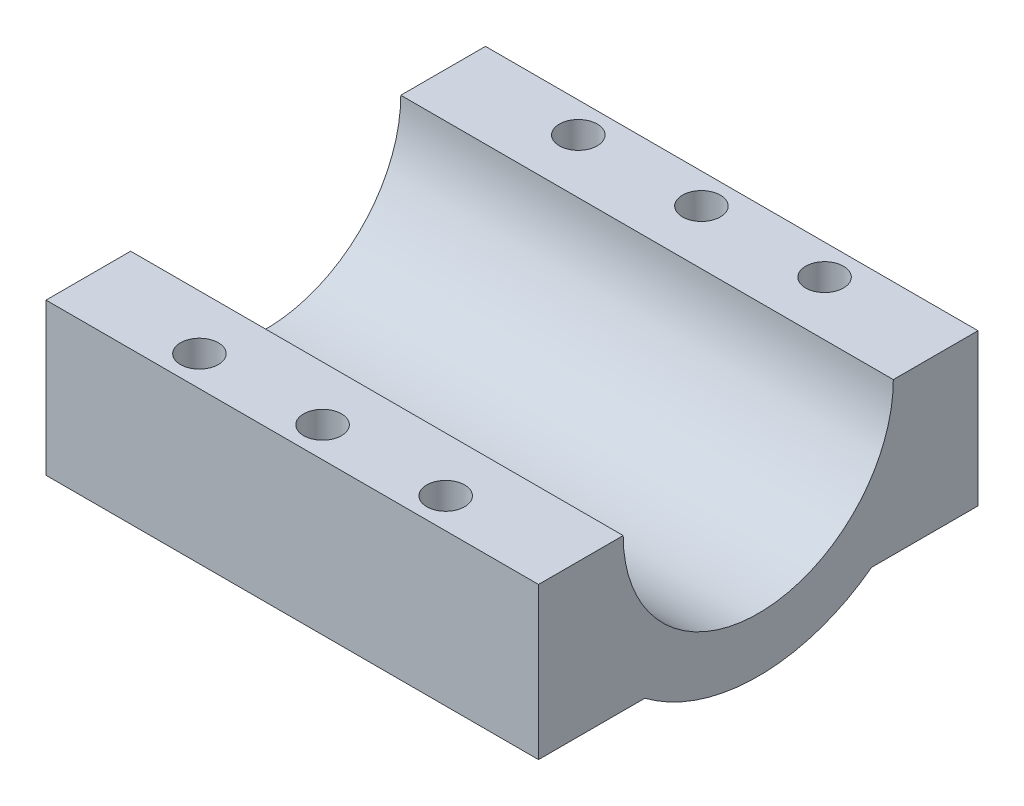
ISO-10303-21;
HEADER;
FILE_DESCRIPTION(('STEP AP214'),'2;1');
FILE_NAME('part.step','',(''),(''),'','','');
FILE_SCHEMA(('AUTOMOTIVE_DESIGN { 1 0 10303 214 1 1 1 1 }'));
ENDSEC;
DATA;
#1=APPLICATION_CONTEXT('core data for automotive mechanical design processes');
#2=APPLICATION_PROTOCOL_DEFINITION('international standard','automotive_design',2000,#1);
#3=PRODUCT_CONTEXT('',#1,'mechanical');
#4=PRODUCT('Part','Part','',(#3));
#5=PRODUCT_RELATED_PRODUCT_CATEGORY('part','',(#4));
#6=PRODUCT_DEFINITION_FORMATION('','',#4);
#7=PRODUCT_DEFINITION_CONTEXT('part definition',#1,'design');
#8=PRODUCT_DEFINITION('design','',#6,#7);
#9=PRODUCT_DEFINITION_SHAPE('','',#8);
#10=(LENGTH_UNIT() NAMED_UNIT(*) SI_UNIT(.MILLI.,.METRE.));
#11=(NAMED_UNIT(*) PLANE_ANGLE_UNIT() SI_UNIT($,.RADIAN.));
#12=(NAMED_UNIT(*) SI_UNIT($,.STERADIAN.) SOLID_ANGLE_UNIT());
#13=UNCERTAINTY_MEASURE_WITH_UNIT(LENGTH_MEASURE(1.E-05),#10,'distance_accuracy_value','');
#14=(GEOMETRIC_REPRESENTATION_CONTEXT(3) GLOBAL_UNCERTAINTY_ASSIGNED_CONTEXT((#13)) GLOBAL_UNIT_ASSIGNED_CONTEXT((#10,
#11,#12)) REPRESENTATION_CONTEXT('',''));
#15=CARTESIAN_POINT('',(0.,0.,0.));
#16=DIRECTION('',(0.,0.,1.));
#17=DIRECTION('',(1.,0.,0.));
#18=AXIS2_PLACEMENT_3D('',#15,#16,#17);
#19=CARTESIAN_POINT('',(0.,25.,0.));
#20=DIRECTION('',(0.,-1.,0.));
#21=DIRECTION('',(0.,0.,-1.));
#22=AXIS2_PLACEMENT_3D('',#19,#20,#21);
#23=PLANE('',#22);
#24=CARTESIAN_POINT('',(0.,25.,-25.));
#25=DIRECTION('',(0.,1.,0.));
#26=DIRECTION('',(0.,0.,1.));
#27=AXIS2_PLACEMENT_3D('',#24,#25,#26);
#28=CIRCLE('',#27,2.5);
#29=CARTESIAN_POINT('',(0.,25.,-22.5));
#30=VERTEX_POINT('',#29);
#31=EDGE_CURVE('E177',#30,#30,#28,.T.);
#32=ORIENTED_EDGE('',*,*,#31,.F.);
#33=EDGE_LOOP('',(#32));
#34=FACE_BOUND('',#33,.T.);
#35=CARTESIAN_POINT('',(16.25,25.,-25.));
#36=DIRECTION('',(0.,1.,0.));
#37=DIRECTION('',(0.,0.,1.));
#38=AXIS2_PLACEMENT_3D('',#35,#36,#37);
#39=CIRCLE('',#38,2.5);
#40=CARTESIAN_POINT('',(16.25,25.,-22.5));
#41=VERTEX_POINT('',#40);
#42=EDGE_CURVE('E189',#41,#41,#39,.T.);
#43=ORIENTED_EDGE('',*,*,#42,.F.);
#44=EDGE_LOOP('',(#43));
#45=FACE_BOUND('',#44,.T.);
#46=CARTESIAN_POINT('',(-16.25,25.,-25.));
#47=DIRECTION('',(0.,1.,0.));
#48=DIRECTION('',(0.,0.,1.));
#49=AXIS2_PLACEMENT_3D('',#46,#47,#48);
#50=CIRCLE('',#49,2.5);
#51=CARTESIAN_POINT('',(-16.25,25.,-22.5));
#52=VERTEX_POINT('',#51);
#53=EDGE_CURVE('E193',#52,#52,#50,.T.);
#54=ORIENTED_EDGE('',*,*,#53,.F.);
#55=EDGE_LOOP('',(#54));
#56=FACE_BOUND('',#55,.T.);
#57=DIRECTION('',(0.,0.,1.));
#58=VECTOR('',#57,1.);
#59=CARTESIAN_POINT('',(-32.5,25.,29.));
#60=LINE('',#59,#58);
#61=CARTESIAN_POINT('',(-32.5,25.,-29.));
#62=VERTEX_POINT('',#61);
#63=CARTESIAN_POINT('',(-32.5,25.,-17.825));
#64=VERTEX_POINT('',#63);
#65=EDGE_CURVE('E206',#62,#64,#60,.T.);
#66=ORIENTED_EDGE('',*,*,#65,.T.);
#67=DIRECTION('',(1.,0.,0.));
#68=VECTOR('',#67,1.);
#69=CARTESIAN_POINT('',(-32.5,25.,-17.825));
#70=LINE('',#69,#68);
#71=CARTESIAN_POINT('',(32.5,25.,-17.825));
#72=VERTEX_POINT('',#71);
#73=EDGE_CURVE('E59',#64,#72,#70,.T.);
#74=ORIENTED_EDGE('',*,*,#73,.T.);
#75=DIRECTION('',(0.,0.,-1.));
#76=VECTOR('',#75,1.);
#77=CARTESIAN_POINT('',(32.5,25.,29.));
#78=LINE('',#77,#76);
#79=CARTESIAN_POINT('',(32.5,25.,-29.));
#80=VERTEX_POINT('',#79);
#81=EDGE_CURVE('E197',#72,#80,#78,.T.);
#82=ORIENTED_EDGE('',*,*,#81,.T.);
#83=DIRECTION('',(-1.,0.,0.));
#84=VECTOR('',#83,1.);
#85=CARTESIAN_POINT('',(-32.5,25.,-29.));
#86=LINE('',#85,#84);
#87=EDGE_CURVE('E202',#80,#62,#86,.T.);
#88=ORIENTED_EDGE('',*,*,#87,.T.);
#89=EDGE_LOOP('',(#66,#74,#82,#88));
#90=FACE_BOUND('',#89,.T.);
#91=ADVANCED_FACE('F43',(#34,#45,#56,#90),#23,.F.);
#92=CARTESIAN_POINT('',(32.5,25.,29.));
#93=VERTEX_POINT('',#92);
#94=CARTESIAN_POINT('',(32.5,25.,17.825));
#95=VERTEX_POINT('',#94);
#96=EDGE_CURVE('E198',#93,#95,#78,.T.);
#97=ORIENTED_EDGE('',*,*,#96,.T.);
#98=DIRECTION('',(1.,0.,0.));
#99=VECTOR('',#98,1.);
#100=CARTESIAN_POINT('',(-32.5,25.,17.825));
#101=LINE('',#100,#99);
#102=CARTESIAN_POINT('',(-32.5,25.,17.825));
#103=VERTEX_POINT('',#102);
#104=EDGE_CURVE('E167',#95,#103,#101,.F.);
#105=ORIENTED_EDGE('',*,*,#104,.T.);
#106=CARTESIAN_POINT('',(-32.5,25.,29.));
#107=VERTEX_POINT('',#106);
#108=EDGE_CURVE('E205',#103,#107,#60,.T.);
#109=ORIENTED_EDGE('',*,*,#108,.T.);
#110=DIRECTION('',(1.,0.,0.));
#111=VECTOR('',#110,1.);
#112=CARTESIAN_POINT('',(-32.5,25.,29.));
#113=LINE('',#112,#111);
#114=EDGE_CURVE('E210',#107,#93,#113,.T.);
#115=ORIENTED_EDGE('',*,*,#114,.T.);
#116=EDGE_LOOP('',(#97,#105,#109,#115));
#117=FACE_BOUND('',#116,.T.);
#118=CARTESIAN_POINT('',(16.25,25.,25.));
#119=DIRECTION('',(0.,1.,0.));
#120=DIRECTION('',(0.,0.,-1.));
#121=AXIS2_PLACEMENT_3D('',#118,#119,#120);
#122=CIRCLE('',#121,2.5);
#123=CARTESIAN_POINT('',(16.25,25.,22.5));
#124=VERTEX_POINT('',#123);
#125=EDGE_CURVE('E185',#124,#124,#122,.T.);
#126=ORIENTED_EDGE('',*,*,#125,.F.);
#127=EDGE_LOOP('',(#126));
#128=FACE_BOUND('',#127,.T.);
#129=CARTESIAN_POINT('',(-16.25,25.,25.));
#130=DIRECTION('',(0.,1.,0.));
#131=DIRECTION('',(0.,0.,-1.));
#132=AXIS2_PLACEMENT_3D('',#129,#130,#131);
#133=CIRCLE('',#132,2.5);
#134=CARTESIAN_POINT('',(-16.25,25.,22.5));
#135=VERTEX_POINT('',#134);
#136=EDGE_CURVE('E181',#135,#135,#133,.T.);
#137=ORIENTED_EDGE('',*,*,#136,.F.);
#138=EDGE_LOOP('',(#137));
#139=FACE_BOUND('',#138,.T.);
#140=CARTESIAN_POINT('',(0.,25.,25.));
#141=DIRECTION('',(0.,1.,0.));
#142=DIRECTION('',(0.,0.,1.));
#143=AXIS2_PLACEMENT_3D('',#140,#141,#142);
#144=CIRCLE('',#143,2.5);
#145=CARTESIAN_POINT('',(0.,25.,27.5));
#146=VERTEX_POINT('',#145);
#147=EDGE_CURVE('E173',#146,#146,#144,.T.);
#148=ORIENTED_EDGE('',*,*,#147,.F.);
#149=EDGE_LOOP('',(#148));
#150=FACE_BOUND('',#149,.T.);
#151=ADVANCED_FACE('F243',(#117,#128,#139,#150),#23,.F.);
#152=CARTESIAN_POINT('',(32.5,25.,29.));
#153=DIRECTION('',(-1.,0.,0.));
#154=DIRECTION('',(0.,0.,1.));
#155=AXIS2_PLACEMENT_3D('',#152,#153,#154);
#156=PLANE('',#155);
#157=ORIENTED_EDGE('',*,*,#81,.F.);
#158=CARTESIAN_POINT('',(32.5,25.,0.));
#159=DIRECTION('',(1.,0.,0.));
#160=DIRECTION('',(0.,0.,-1.));
#161=AXIS2_PLACEMENT_3D('',#158,#159,#160);
#162=CIRCLE('',#161,17.825);
#163=EDGE_CURVE('E132',#95,#72,#162,.T.);
#164=ORIENTED_EDGE('',*,*,#163,.F.);
#165=ORIENTED_EDGE('',*,*,#96,.F.);
#166=DIRECTION('',(0.,-1.,0.));
#167=VECTOR('',#166,1.);
#168=CARTESIAN_POINT('',(32.5,25.,29.));
#169=LINE('',#168,#167);
#170=CARTESIAN_POINT('',(32.5,4.97292357485923,29.));
#171=VERTEX_POINT('',#170);
#172=EDGE_CURVE('E213',#93,#171,#169,.T.);
#173=ORIENTED_EDGE('',*,*,#172,.T.);
#174=DIRECTION('',(0.,0.,1.));
#175=VECTOR('',#174,1.);
#176=CARTESIAN_POINT('',(32.5,4.97292357485922,14.9638300532173));
#177=LINE('',#176,#175);
#178=CARTESIAN_POINT('',(32.5,4.97292357485922,14.9638300532173));
#179=VERTEX_POINT('',#178);
#180=EDGE_CURVE('E66',#179,#171,#177,.T.);
#181=ORIENTED_EDGE('',*,*,#180,.F.);
#182=CARTESIAN_POINT('',(32.5,25.,0.));
#183=DIRECTION('',(-1.,0.,0.));
#184=DIRECTION('',(0.,0.,-1.));
#185=AXIS2_PLACEMENT_3D('',#182,#183,#184);
#186=CIRCLE('',#185,25.);
#187=CARTESIAN_POINT('',(32.5,4.97292357485923,-14.9638300532173));
#188=VERTEX_POINT('',#187);
#189=EDGE_CURVE('E112',#188,#179,#186,.T.);
#190=ORIENTED_EDGE('',*,*,#189,.F.);
#191=DIRECTION('',(0.,0.,1.));
#192=VECTOR('',#191,1.);
#193=CARTESIAN_POINT('',(32.5,4.97292357485923,-29.));
#194=LINE('',#193,#192);
#195=CARTESIAN_POINT('',(32.5,4.97292357485923,-29.));
#196=VERTEX_POINT('',#195);
#197=EDGE_CURVE('E121',#196,#188,#194,.T.);
#198=ORIENTED_EDGE('',*,*,#197,.F.);
#199=DIRECTION('',(0.,-1.,0.));
#200=VECTOR('',#199,1.);
#201=CARTESIAN_POINT('',(32.5,25.,-29.));
#202=LINE('',#201,#200);
#203=EDGE_CURVE('E52',#80,#196,#202,.T.);
#204=ORIENTED_EDGE('',*,*,#203,.F.);
#205=EDGE_LOOP('',(#157,#164,#165,#173,#181,#190,#198,#204));
#206=FACE_BOUND('',#205,.T.);
#207=ADVANCED_FACE('F45',(#206),#156,.F.);
#208=CARTESIAN_POINT('',(-32.5,25.,-29.));
#209=DIRECTION('',(0.,0.,1.));
#210=DIRECTION('',(1.,0.,0.));
#211=AXIS2_PLACEMENT_3D('',#208,#209,#210);
#212=PLANE('',#211);
#213=ORIENTED_EDGE('',*,*,#203,.T.);
#214=DIRECTION('',(1.,0.,0.));
#215=VECTOR('',#214,1.);
#216=CARTESIAN_POINT('',(-32.5,4.97292357485923,-29.));
#217=LINE('',#216,#215);
#218=CARTESIAN_POINT('',(-32.5,4.97292357485923,-29.));
#219=VERTEX_POINT('',#218);
#220=EDGE_CURVE('E118',#219,#196,#217,.T.);
#221=ORIENTED_EDGE('',*,*,#220,.F.);
#222=DIRECTION('',(0.,-1.,0.));
#223=VECTOR('',#222,1.);
#224=CARTESIAN_POINT('',(-32.5,25.,-29.));
#225=LINE('',#224,#223);
#226=EDGE_CURVE('E220',#62,#219,#225,.T.);
#227=ORIENTED_EDGE('',*,*,#226,.F.);
#228=ORIENTED_EDGE('',*,*,#87,.F.);
#229=EDGE_LOOP('',(#213,#221,#227,#228));
#230=FACE_BOUND('',#229,.T.);
#231=ADVANCED_FACE('F266',(#230),#212,.F.);
#232=CARTESIAN_POINT('',(-32.5,25.,29.));
#233=DIRECTION('',(1.,0.,0.));
#234=DIRECTION('',(0.,0.,-1.));
#235=AXIS2_PLACEMENT_3D('',#232,#233,#234);
#236=PLANE('',#235);
#237=ORIENTED_EDGE('',*,*,#108,.F.);
#238=CARTESIAN_POINT('',(-32.5,25.,0.));
#239=DIRECTION('',(1.,0.,0.));
#240=DIRECTION('',(0.,0.,-1.));
#241=AXIS2_PLACEMENT_3D('',#238,#239,#240);
#242=CIRCLE('',#241,17.825);
#243=EDGE_CURVE('E11',#103,#64,#242,.T.);
#244=ORIENTED_EDGE('',*,*,#243,.T.);
#245=ORIENTED_EDGE('',*,*,#65,.F.);
#246=ORIENTED_EDGE('',*,*,#226,.T.);
#247=DIRECTION('',(0.,0.,1.));
#248=VECTOR('',#247,1.);
#249=CARTESIAN_POINT('',(-32.5,4.97292357485923,-29.));
#250=LINE('',#249,#248);
#251=CARTESIAN_POINT('',(-32.5,4.97292357485923,-14.9638300532173));
#252=VERTEX_POINT('',#251);
#253=EDGE_CURVE('E140',#219,#252,#250,.T.);
#254=ORIENTED_EDGE('',*,*,#253,.T.);
#255=CARTESIAN_POINT('',(-32.5,25.,0.));
#256=DIRECTION('',(-1.,0.,0.));
#257=DIRECTION('',(0.,0.,-1.));
#258=AXIS2_PLACEMENT_3D('',#255,#256,#257);
#259=CIRCLE('',#258,25.);
#260=CARTESIAN_POINT('',(-32.5,4.97292357485922,14.9638300532173));
#261=VERTEX_POINT('',#260);
#262=EDGE_CURVE('E114',#252,#261,#259,.T.);
#263=ORIENTED_EDGE('',*,*,#262,.T.);
#264=DIRECTION('',(0.,0.,1.));
#265=VECTOR('',#264,1.);
#266=CARTESIAN_POINT('',(-32.5,4.97292357485922,14.9638300532173));
#267=LINE('',#266,#265);
#268=CARTESIAN_POINT('',(-32.5,4.97292357485922,29.));
#269=VERTEX_POINT('',#268);
#270=EDGE_CURVE('E143',#261,#269,#267,.T.);
#271=ORIENTED_EDGE('',*,*,#270,.T.);
#272=DIRECTION('',(0.,-1.,0.));
#273=VECTOR('',#272,1.);
#274=CARTESIAN_POINT('',(-32.5,25.,29.));
#275=LINE('',#274,#273);
#276=EDGE_CURVE('E216',#107,#269,#275,.T.);
#277=ORIENTED_EDGE('',*,*,#276,.F.);
#278=EDGE_LOOP('',(#237,#244,#245,#246,#254,#263,#271,#277));
#279=FACE_BOUND('',#278,.T.);
#280=ADVANCED_FACE('F254',(#279),#236,.F.);
#281=CARTESIAN_POINT('',(-32.5,25.,29.));
#282=DIRECTION('',(0.,0.,-1.));
#283=DIRECTION('',(-1.,0.,0.));
#284=AXIS2_PLACEMENT_3D('',#281,#282,#283);
#285=PLANE('',#284);
#286=ORIENTED_EDGE('',*,*,#276,.T.);
#287=DIRECTION('',(1.,0.,0.));
#288=VECTOR('',#287,1.);
#289=CARTESIAN_POINT('',(-32.5,4.97292357485922,29.));
#290=LINE('',#289,#288);
#291=EDGE_CURVE('E268',#269,#171,#290,.T.);
#292=ORIENTED_EDGE('',*,*,#291,.T.);
#293=ORIENTED_EDGE('',*,*,#172,.F.);
#294=ORIENTED_EDGE('',*,*,#114,.F.);
#295=EDGE_LOOP('',(#286,#292,#293,#294));
#296=FACE_BOUND('',#295,.T.);
#297=ADVANCED_FACE('F277',(#296),#285,.F.);
#298=CARTESIAN_POINT('',(-16.25,25.,-25.));
#299=DIRECTION('',(0.,-1.,0.));
#300=DIRECTION('',(0.,0.,-1.));
#301=AXIS2_PLACEMENT_3D('',#298,#299,#300);
#302=CYLINDRICAL_SURFACE('',#301,2.5);
#303=CARTESIAN_POINT('',(-16.25,4.97292357485923,-25.));
#304=DIRECTION('',(0.,1.,0.));
#305=DIRECTION('',(0.,0.,1.));
#306=AXIS2_PLACEMENT_3D('',#303,#304,#305);
#307=CIRCLE('',#306,2.5);
#308=CARTESIAN_POINT('',(-16.25,4.97292357485923,-22.5));
#309=VERTEX_POINT('',#308);
#310=EDGE_CURVE('E163',#309,#309,#307,.T.);
#311=ORIENTED_EDGE('',*,*,#310,.F.);
#312=EDGE_LOOP('',(#311));
#313=FACE_BOUND('',#312,.T.);
#314=ORIENTED_EDGE('',*,*,#53,.T.);
#315=EDGE_LOOP('',(#314));
#316=FACE_BOUND('',#315,.T.);
#317=ADVANCED_FACE('F279',(#313,#316),#302,.F.);
#318=CARTESIAN_POINT('',(16.25,25.,-25.));
#319=DIRECTION('',(0.,-1.,0.));
#320=DIRECTION('',(0.,0.,-1.));
#321=AXIS2_PLACEMENT_3D('',#318,#319,#320);
#322=CYLINDRICAL_SURFACE('',#321,2.5);
#323=CARTESIAN_POINT('',(16.25,4.97292357485923,-25.));
#324=DIRECTION('',(0.,1.,0.));
#325=DIRECTION('',(0.,0.,1.));
#326=AXIS2_PLACEMENT_3D('',#323,#324,#325);
#327=CIRCLE('',#326,2.5);
#328=CARTESIAN_POINT('',(16.25,4.97292357485923,-22.5));
#329=VERTEX_POINT('',#328);
#330=EDGE_CURVE('E159',#329,#329,#327,.T.);
#331=ORIENTED_EDGE('',*,*,#330,.F.);
#332=EDGE_LOOP('',(#331));
#333=FACE_BOUND('',#332,.T.);
#334=ORIENTED_EDGE('',*,*,#42,.T.);
#335=EDGE_LOOP('',(#334));
#336=FACE_BOUND('',#335,.T.);
#337=ADVANCED_FACE('F285',(#333,#336),#322,.F.);
#338=CARTESIAN_POINT('',(16.25,25.,25.));
#339=DIRECTION('',(0.,-1.,0.));
#340=DIRECTION('',(0.,0.,-1.));
#341=AXIS2_PLACEMENT_3D('',#338,#339,#340);
#342=CYLINDRICAL_SURFACE('',#341,2.5);
#343=CARTESIAN_POINT('',(16.25,4.97292357485922,25.));
#344=DIRECTION('',(0.,1.,0.));
#345=DIRECTION('',(0.,0.,1.));
#346=AXIS2_PLACEMENT_3D('',#343,#344,#345);
#347=CIRCLE('',#346,2.5);
#348=CARTESIAN_POINT('',(16.25,4.97292357485922,27.5));
#349=VERTEX_POINT('',#348);
#350=EDGE_CURVE('E154',#349,#349,#347,.T.);
#351=ORIENTED_EDGE('',*,*,#350,.F.);
#352=EDGE_LOOP('',(#351));
#353=FACE_BOUND('',#352,.T.);
#354=ORIENTED_EDGE('',*,*,#125,.T.);
#355=EDGE_LOOP('',(#354));
#356=FACE_BOUND('',#355,.T.);
#357=ADVANCED_FACE('F373',(#353,#356),#342,.F.);
#358=CARTESIAN_POINT('',(-16.25,25.,25.));
#359=DIRECTION('',(0.,-1.,0.));
#360=DIRECTION('',(0.,0.,-1.));
#361=AXIS2_PLACEMENT_3D('',#358,#359,#360);
#362=CYLINDRICAL_SURFACE('',#361,2.5);
#363=CARTESIAN_POINT('',(-16.25,4.97292357485922,25.));
#364=DIRECTION('',(0.,1.,0.));
#365=DIRECTION('',(0.,0.,1.));
#366=AXIS2_PLACEMENT_3D('',#363,#364,#365);
#367=CIRCLE('',#366,2.5);
#368=CARTESIAN_POINT('',(-16.25,4.97292357485922,27.5));
#369=VERTEX_POINT('',#368);
#370=EDGE_CURVE('E150',#369,#369,#367,.T.);
#371=ORIENTED_EDGE('',*,*,#370,.F.);
#372=EDGE_LOOP('',(#371));
#373=FACE_BOUND('',#372,.T.);
#374=ORIENTED_EDGE('',*,*,#136,.T.);
#375=EDGE_LOOP('',(#374));
#376=FACE_BOUND('',#375,.T.);
#377=ADVANCED_FACE('F237',(#373,#376),#362,.F.);
#378=CARTESIAN_POINT('',(0.,25.,-25.));
#379=DIRECTION('',(0.,-1.,0.));
#380=DIRECTION('',(0.,0.,-1.));
#381=AXIS2_PLACEMENT_3D('',#378,#379,#380);
#382=CYLINDRICAL_SURFACE('',#381,2.5);
#383=CARTESIAN_POINT('',(0.,4.97292357485923,-25.));
#384=DIRECTION('',(0.,1.,0.));
#385=DIRECTION('',(0.,0.,1.));
#386=AXIS2_PLACEMENT_3D('',#383,#384,#385);
#387=CIRCLE('',#386,2.5);
#388=CARTESIAN_POINT('',(0.,4.97292357485923,-22.5));
#389=VERTEX_POINT('',#388);
#390=EDGE_CURVE('E158',#389,#389,#387,.T.);
#391=ORIENTED_EDGE('',*,*,#390,.F.);
#392=EDGE_LOOP('',(#391));
#393=FACE_BOUND('',#392,.T.);
#394=ORIENTED_EDGE('',*,*,#31,.T.);
#395=EDGE_LOOP('',(#394));
#396=FACE_BOUND('',#395,.T.);
#397=ADVANCED_FACE('F233',(#393,#396),#382,.F.);
#398=CARTESIAN_POINT('',(0.,25.,25.));
#399=DIRECTION('',(0.,-1.,0.));
#400=DIRECTION('',(0.,0.,-1.));
#401=AXIS2_PLACEMENT_3D('',#398,#399,#400);
#402=CYLINDRICAL_SURFACE('',#401,2.5);
#403=CARTESIAN_POINT('',(0.,4.97292357485922,25.));
#404=DIRECTION('',(0.,1.,0.));
#405=DIRECTION('',(0.,0.,1.));
#406=AXIS2_PLACEMENT_3D('',#403,#404,#405);
#407=CIRCLE('',#406,2.5);
#408=CARTESIAN_POINT('',(0.,4.97292357485922,27.5));
#409=VERTEX_POINT('',#408);
#410=EDGE_CURVE('E136',#409,#409,#407,.T.);
#411=ORIENTED_EDGE('',*,*,#410,.F.);
#412=EDGE_LOOP('',(#411));
#413=FACE_BOUND('',#412,.T.);
#414=ORIENTED_EDGE('',*,*,#147,.T.);
#415=EDGE_LOOP('',(#414));
#416=FACE_BOUND('',#415,.T.);
#417=ADVANCED_FACE('F236',(#413,#416),#402,.F.);
#418=CARTESIAN_POINT('',(-32.5,25.,0.));
#419=DIRECTION('',(1.,0.,0.));
#420=DIRECTION('',(0.,0.,-1.));
#421=AXIS2_PLACEMENT_3D('',#418,#419,#420);
#422=CYLINDRICAL_SURFACE('',#421,25.);
#423=ORIENTED_EDGE('',*,*,#189,.T.);
#424=DIRECTION('',(1.,0.,0.));
#425=VECTOR('',#424,1.);
#426=CARTESIAN_POINT('',(-32.5,4.97292357485922,14.9638300532173));
#427=LINE('',#426,#425);
#428=EDGE_CURVE('E144',#261,#179,#427,.T.);
#429=ORIENTED_EDGE('',*,*,#428,.F.);
#430=ORIENTED_EDGE('',*,*,#262,.F.);
#431=DIRECTION('',(1.,0.,0.));
#432=VECTOR('',#431,1.);
#433=CARTESIAN_POINT('',(-32.5,4.97292357485923,-14.9638300532173));
#434=LINE('',#433,#432);
#435=EDGE_CURVE('E108',#252,#188,#434,.T.);
#436=ORIENTED_EDGE('',*,*,#435,.T.);
#437=EDGE_LOOP('',(#423,#429,#430,#436));
#438=FACE_BOUND('',#437,.T.);
#439=ADVANCED_FACE('F110',(#438),#422,.T.);
#440=CARTESIAN_POINT('',(-32.5,4.97292357485923,-29.));
#441=DIRECTION('',(0.,1.,0.));
#442=DIRECTION('',(0.,0.,1.));
#443=AXIS2_PLACEMENT_3D('',#440,#441,#442);
#444=PLANE('',#443);
#445=ORIENTED_EDGE('',*,*,#310,.T.);
#446=EDGE_LOOP('',(#445));
#447=FACE_BOUND('',#446,.T.);
#448=ORIENTED_EDGE('',*,*,#330,.T.);
#449=EDGE_LOOP('',(#448));
#450=FACE_BOUND('',#449,.T.);
#451=ORIENTED_EDGE('',*,*,#390,.T.);
#452=EDGE_LOOP('',(#451));
#453=FACE_BOUND('',#452,.T.);
#454=ORIENTED_EDGE('',*,*,#197,.T.);
#455=ORIENTED_EDGE('',*,*,#435,.F.);
#456=ORIENTED_EDGE('',*,*,#253,.F.);
#457=ORIENTED_EDGE('',*,*,#220,.T.);
#458=EDGE_LOOP('',(#454,#455,#456,#457));
#459=FACE_BOUND('',#458,.T.);
#460=ADVANCED_FACE('F122',(#447,#450,#453,#459),#444,.F.);
#461=CARTESIAN_POINT('',(-32.5,4.97292357485922,14.9638300532173));
#462=DIRECTION('',(0.,1.,0.));
#463=DIRECTION('',(0.,0.,1.));
#464=AXIS2_PLACEMENT_3D('',#461,#462,#463);
#465=PLANE('',#464);
#466=ORIENTED_EDGE('',*,*,#350,.T.);
#467=EDGE_LOOP('',(#466));
#468=FACE_BOUND('',#467,.T.);
#469=ORIENTED_EDGE('',*,*,#370,.T.);
#470=EDGE_LOOP('',(#469));
#471=FACE_BOUND('',#470,.T.);
#472=ORIENTED_EDGE('',*,*,#410,.T.);
#473=EDGE_LOOP('',(#472));
#474=FACE_BOUND('',#473,.T.);
#475=ORIENTED_EDGE('',*,*,#180,.T.);
#476=ORIENTED_EDGE('',*,*,#291,.F.);
#477=ORIENTED_EDGE('',*,*,#270,.F.);
#478=ORIENTED_EDGE('',*,*,#428,.T.);
#479=EDGE_LOOP('',(#475,#476,#477,#478));
#480=FACE_BOUND('',#479,.T.);
#481=ADVANCED_FACE('F275',(#468,#471,#474,#480),#465,.F.);
#482=CARTESIAN_POINT('',(-32.5,25.,0.));
#483=DIRECTION('',(1.,0.,0.));
#484=DIRECTION('',(0.,0.,-1.));
#485=AXIS2_PLACEMENT_3D('',#482,#483,#484);
#486=CYLINDRICAL_SURFACE('',#485,17.825);
#487=ORIENTED_EDGE('',*,*,#243,.F.);
#488=ORIENTED_EDGE('',*,*,#104,.F.);
#489=ORIENTED_EDGE('',*,*,#163,.T.);
#490=ORIENTED_EDGE('',*,*,#73,.F.);
#491=EDGE_LOOP('',(#487,#488,#489,#490));
#492=FACE_BOUND('',#491,.T.);
#493=ADVANCED_FACE('F256',(#492),#486,.F.);
#494=CLOSED_SHELL('',(#91,#151,#207,#231,#280,#297,#317,#337,#357,#377,#397,#417,#439,#460,#481,#493));
#495=MANIFOLD_SOLID_BREP('B2',#494);
#496=ADVANCED_BREP_SHAPE_REPRESENTATION('',(#18,#495),#14);
#497=SHAPE_DEFINITION_REPRESENTATION(#9,#496);
ENDSEC;
END-ISO-10303-21;
